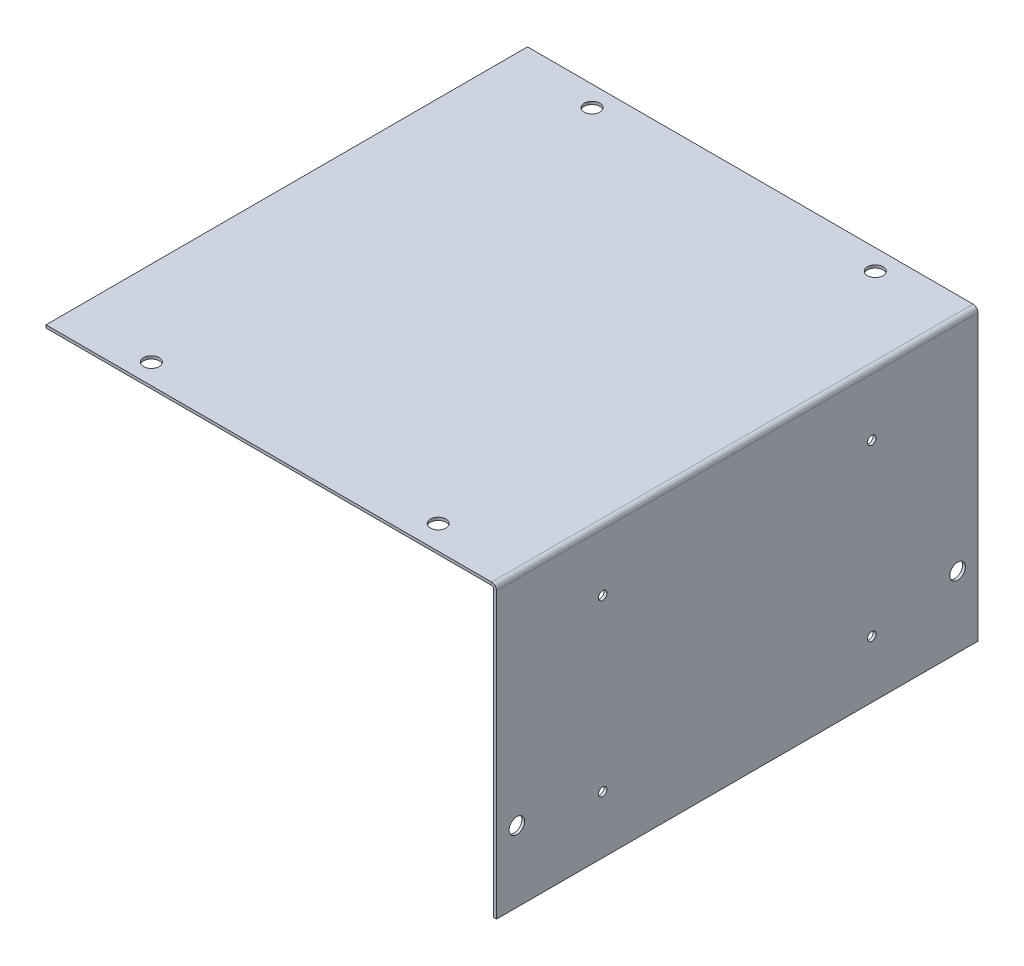
ISO-10303-21;
HEADER;
FILE_DESCRIPTION(('STEP AP214'),'2;1');
FILE_NAME('part.step','',(''),(''),'','','');
FILE_SCHEMA(('AUTOMOTIVE_DESIGN { 1 0 10303 214 1 1 1 1 }'));
ENDSEC;
DATA;
#1=APPLICATION_CONTEXT('core data for automotive mechanical design processes');
#2=APPLICATION_PROTOCOL_DEFINITION('international standard','automotive_design',2000,#1);
#3=PRODUCT_CONTEXT('',#1,'mechanical');
#4=PRODUCT('Part','Part','',(#3));
#5=PRODUCT_RELATED_PRODUCT_CATEGORY('part','',(#4));
#6=PRODUCT_DEFINITION_FORMATION('','',#4);
#7=PRODUCT_DEFINITION_CONTEXT('part definition',#1,'design');
#8=PRODUCT_DEFINITION('design','',#6,#7);
#9=PRODUCT_DEFINITION_SHAPE('','',#8);
#10=(LENGTH_UNIT() NAMED_UNIT(*) SI_UNIT(.MILLI.,.METRE.));
#11=(NAMED_UNIT(*) PLANE_ANGLE_UNIT() SI_UNIT($,.RADIAN.));
#12=(NAMED_UNIT(*) SI_UNIT($,.STERADIAN.) SOLID_ANGLE_UNIT());
#13=UNCERTAINTY_MEASURE_WITH_UNIT(LENGTH_MEASURE(1.E-05),#10,'distance_accuracy_value','');
#14=(GEOMETRIC_REPRESENTATION_CONTEXT(3) GLOBAL_UNCERTAINTY_ASSIGNED_CONTEXT((#13)) GLOBAL_UNIT_ASSIGNED_CONTEXT((#10,
#11,#12)) REPRESENTATION_CONTEXT('',''));
#15=CARTESIAN_POINT('',(0.,0.,0.));
#16=DIRECTION('',(0.,0.,1.));
#17=DIRECTION('',(1.,0.,0.));
#18=AXIS2_PLACEMENT_3D('',#15,#16,#17);
#19=CARTESIAN_POINT('',(1.71582040533197,26.7435444579773,170.));
#20=DIRECTION('',(0.,0.,1.));
#21=DIRECTION('',(1.,0.,0.));
#22=AXIS2_PLACEMENT_3D('',#19,#20,#21);
#23=PLANE('',#22);
#24=DIRECTION('',(0.,1.,0.));
#25=VECTOR('',#24,1.);
#26=CARTESIAN_POINT('',(1.71582040533197,26.7435444579773,170.));
#27=LINE('',#26,#25);
#28=CARTESIAN_POINT('',(1.71582040533197,26.7435444579773,170.));
#29=VERTEX_POINT('',#28);
#30=CARTESIAN_POINT('',(1.71582040533198,27.7435444579773,170.));
#31=VERTEX_POINT('',#30);
#32=EDGE_CURVE('E11',#29,#31,#27,.T.);
#33=ORIENTED_EDGE('',*,*,#32,.F.);
#34=CARTESIAN_POINT('',(1.71582040533196,26.0069444579773,170.));
#35=DIRECTION('',(0.,0.,1.));
#36=DIRECTION('',(1.,0.,0.));
#37=AXIS2_PLACEMENT_3D('',#34,#35,#36);
#38=CIRCLE('',#37,0.7366);
#39=CARTESIAN_POINT('',(2.45242040533196,26.0069444579773,170.));
#40=VERTEX_POINT('',#39);
#41=EDGE_CURVE('E126',#29,#40,#38,.F.);
#42=ORIENTED_EDGE('',*,*,#41,.T.);
#43=DIRECTION('',(-1.,0.,0.));
#44=VECTOR('',#43,1.);
#45=CARTESIAN_POINT('',(3.45242040533196,26.0069444579773,170.));
#46=LINE('',#45,#44);
#47=CARTESIAN_POINT('',(3.45242040533196,26.0069444579773,170.));
#48=VERTEX_POINT('',#47);
#49=EDGE_CURVE('E43',#48,#40,#46,.T.);
#50=ORIENTED_EDGE('',*,*,#49,.F.);
#51=CARTESIAN_POINT('',(1.71582040533196,26.0069444579773,170.));
#52=DIRECTION('',(0.,0.,1.));
#53=DIRECTION('',(1.,0.,0.));
#54=AXIS2_PLACEMENT_3D('',#51,#52,#53);
#55=CIRCLE('',#54,1.7366);
#56=EDGE_CURVE('E133',#31,#48,#55,.F.);
#57=ORIENTED_EDGE('',*,*,#56,.F.);
#58=EDGE_LOOP('',(#33,#42,#50,#57));
#59=FACE_BOUND('',#58,.T.);
#60=ADVANCED_FACE('F34',(#59),#23,.T.);
#61=CARTESIAN_POINT('',(3.45242040533196,26.0069444579773,170.));
#62=DIRECTION('',(0.,0.,1.));
#63=DIRECTION('',(1.,0.,0.));
#64=AXIS2_PLACEMENT_3D('',#61,#62,#63);
#65=PLANE('',#64);
#66=DIRECTION('',(1.,0.,0.));
#67=VECTOR('',#66,1.);
#68=CARTESIAN_POINT('',(-155.610979594668,26.7435444579772,170.));
#69=LINE('',#68,#67);
#70=CARTESIAN_POINT('',(-155.610979594668,26.7435444579772,170.));
#71=VERTEX_POINT('',#70);
#72=EDGE_CURVE('E121',#71,#29,#69,.T.);
#73=ORIENTED_EDGE('',*,*,#72,.T.);
#74=ORIENTED_EDGE('',*,*,#32,.T.);
#75=DIRECTION('',(1.,0.,0.));
#76=VECTOR('',#75,1.);
#77=CARTESIAN_POINT('',(-155.610979594668,27.7435444579772,170.));
#78=LINE('',#77,#76);
#79=CARTESIAN_POINT('',(-155.610979594668,27.7435444579772,170.));
#80=VERTEX_POINT('',#79);
#81=EDGE_CURVE('E131',#80,#31,#78,.T.);
#82=ORIENTED_EDGE('',*,*,#81,.F.);
#83=DIRECTION('',(0.,1.,0.));
#84=VECTOR('',#83,1.);
#85=CARTESIAN_POINT('',(-155.610979594668,26.7435444579772,170.));
#86=LINE('',#85,#84);
#87=EDGE_CURVE('E112',#71,#80,#86,.T.);
#88=ORIENTED_EDGE('',*,*,#87,.F.);
#89=EDGE_LOOP('',(#73,#74,#82,#88));
#90=FACE_BOUND('',#89,.T.);
#91=ADVANCED_FACE('F129',(#90),#65,.T.);
#92=CARTESIAN_POINT('',(2.45242040533196,26.0069444579773,0.));
#93=DIRECTION('',(0.,0.,-1.));
#94=DIRECTION('',(-1.,0.,0.));
#95=AXIS2_PLACEMENT_3D('',#92,#93,#94);
#96=PLANE('',#95);
#97=DIRECTION('',(1.,0.,0.));
#98=VECTOR('',#97,1.);
#99=CARTESIAN_POINT('',(2.45242040533196,26.0069444579773,0.));
#100=LINE('',#99,#98);
#101=CARTESIAN_POINT('',(2.45242040533196,26.0069444579773,0.));
#102=VERTEX_POINT('',#101);
#103=CARTESIAN_POINT('',(3.45242040533196,26.0069444579773,0.));
#104=VERTEX_POINT('',#103);
#105=EDGE_CURVE('E87',#102,#104,#100,.T.);
#106=ORIENTED_EDGE('',*,*,#105,.F.);
#107=CARTESIAN_POINT('',(1.71582040533196,26.0069444579773,0.));
#108=DIRECTION('',(0.,0.,1.));
#109=DIRECTION('',(1.,0.,0.));
#110=AXIS2_PLACEMENT_3D('',#107,#108,#109);
#111=CIRCLE('',#110,0.7366);
#112=CARTESIAN_POINT('',(1.71582040533197,26.7435444579773,0.));
#113=VERTEX_POINT('',#112);
#114=EDGE_CURVE('E156',#113,#102,#111,.F.);
#115=ORIENTED_EDGE('',*,*,#114,.F.);
#116=DIRECTION('',(0.,-1.,0.));
#117=VECTOR('',#116,1.);
#118=CARTESIAN_POINT('',(1.71582040533198,27.7435444579773,0.));
#119=LINE('',#118,#117);
#120=CARTESIAN_POINT('',(1.71582040533198,27.7435444579773,0.));
#121=VERTEX_POINT('',#120);
#122=EDGE_CURVE('E80',#121,#113,#119,.T.);
#123=ORIENTED_EDGE('',*,*,#122,.F.);
#124=CARTESIAN_POINT('',(1.71582040533196,26.0069444579773,0.));
#125=DIRECTION('',(0.,0.,1.));
#126=DIRECTION('',(1.,0.,0.));
#127=AXIS2_PLACEMENT_3D('',#124,#125,#126);
#128=CIRCLE('',#127,1.7366);
#129=EDGE_CURVE('E149',#121,#104,#128,.F.);
#130=ORIENTED_EDGE('',*,*,#129,.T.);
#131=EDGE_LOOP('',(#106,#115,#123,#130));
#132=FACE_BOUND('',#131,.T.);
#133=ADVANCED_FACE('F221',(#132),#96,.T.);
#134=CARTESIAN_POINT('',(1.71582040533198,27.7435444579773,0.));
#135=DIRECTION('',(0.,0.,-1.));
#136=DIRECTION('',(-1.,0.,0.));
#137=AXIS2_PLACEMENT_3D('',#134,#135,#136);
#138=PLANE('',#137);
#139=DIRECTION('',(0.,-1.,0.));
#140=VECTOR('',#139,1.);
#141=CARTESIAN_POINT('',(2.45242040533196,26.7435444579773,0.));
#142=LINE('',#141,#140);
#143=CARTESIAN_POINT('',(2.45242040533195,-74.4564555420229,0.));
#144=VERTEX_POINT('',#143);
#145=EDGE_CURVE('E139',#102,#144,#142,.T.);
#146=ORIENTED_EDGE('',*,*,#145,.F.);
#147=ORIENTED_EDGE('',*,*,#105,.T.);
#148=DIRECTION('',(0.,-1.,0.));
#149=VECTOR('',#148,1.);
#150=CARTESIAN_POINT('',(3.45242040533196,26.7435444579773,0.));
#151=LINE('',#150,#149);
#152=CARTESIAN_POINT('',(3.45242040533195,-74.4564555420229,0.));
#153=VERTEX_POINT('',#152);
#154=EDGE_CURVE('E146',#104,#153,#151,.T.);
#155=ORIENTED_EDGE('',*,*,#154,.T.);
#156=DIRECTION('',(-1.,0.,0.));
#157=VECTOR('',#156,1.);
#158=CARTESIAN_POINT('',(3.45242040533195,-74.4564555420229,0.));
#159=LINE('',#158,#157);
#160=EDGE_CURVE('E142',#153,#144,#159,.T.);
#161=ORIENTED_EDGE('',*,*,#160,.T.);
#162=EDGE_LOOP('',(#146,#147,#155,#161));
#163=FACE_BOUND('',#162,.T.);
#164=ADVANCED_FACE('F223',(#163),#138,.T.);
#165=CARTESIAN_POINT('',(2.45242040533196,26.7435444579773,170.));
#166=DIRECTION('',(1.,0.,0.));
#167=DIRECTION('',(0.,1.,0.));
#168=AXIS2_PLACEMENT_3D('',#165,#166,#167);
#169=PLANE('',#168);
#170=CARTESIAN_POINT('',(2.45242040533196,5.7570444579771,132.5));
#171=DIRECTION('',(1.,0.,0.));
#172=DIRECTION('',(0.,1.,0.));
#173=AXIS2_PLACEMENT_3D('',#170,#171,#172);
#174=CIRCLE('',#173,1.49999999999997);
#175=CARTESIAN_POINT('',(2.45242040533196,7.25704445797707,132.5));
#176=VERTEX_POINT('',#175);
#177=EDGE_CURVE('E465',#176,#176,#174,.T.);
#178=ORIENTED_EDGE('',*,*,#177,.T.);
#179=EDGE_LOOP('',(#178));
#180=FACE_BOUND('',#179,.T.);
#181=CARTESIAN_POINT('',(2.45242040533196,5.7570444579771,37.5));
#182=DIRECTION('',(1.,0.,0.));
#183=DIRECTION('',(0.,1.,0.));
#184=AXIS2_PLACEMENT_3D('',#181,#182,#183);
#185=CIRCLE('',#184,1.49999999999997);
#186=CARTESIAN_POINT('',(2.45242040533196,7.25704445797707,37.5));
#187=VERTEX_POINT('',#186);
#188=EDGE_CURVE('E469',#187,#187,#185,.T.);
#189=ORIENTED_EDGE('',*,*,#188,.T.);
#190=EDGE_LOOP('',(#189));
#191=FACE_BOUND('',#190,.T.);
#192=CARTESIAN_POINT('',(2.45242040533195,-54.2429555420229,37.5));
#193=DIRECTION('',(1.,0.,0.));
#194=DIRECTION('',(0.,1.,0.));
#195=AXIS2_PLACEMENT_3D('',#192,#193,#194);
#196=CIRCLE('',#195,1.49999999999997);
#197=CARTESIAN_POINT('',(2.45242040533195,-52.7429555420229,37.5));
#198=VERTEX_POINT('',#197);
#199=EDGE_CURVE('E478',#198,#198,#196,.T.);
#200=ORIENTED_EDGE('',*,*,#199,.T.);
#201=EDGE_LOOP('',(#200));
#202=FACE_BOUND('',#201,.T.);
#203=CARTESIAN_POINT('',(2.45242040533195,-54.2429555420229,132.5));
#204=DIRECTION('',(1.,0.,0.));
#205=DIRECTION('',(0.,1.,0.));
#206=AXIS2_PLACEMENT_3D('',#203,#204,#205);
#207=CIRCLE('',#206,1.49999999999997);
#208=CARTESIAN_POINT('',(2.45242040533195,-52.7429555420229,132.5));
#209=VERTEX_POINT('',#208);
#210=EDGE_CURVE('E484',#209,#209,#207,.T.);
#211=ORIENTED_EDGE('',*,*,#210,.T.);
#212=EDGE_LOOP('',(#211));
#213=FACE_BOUND('',#212,.T.);
#214=CARTESIAN_POINT('',(2.45242040533195,-49.4564555419283,7.19999999999119));
#215=DIRECTION('',(1.,0.,0.));
#216=DIRECTION('',(0.,1.,0.));
#217=AXIS2_PLACEMENT_3D('',#214,#215,#216);
#218=CIRCLE('',#217,2.75);
#219=CARTESIAN_POINT('',(2.45242040533195,-46.7064555419283,7.19999999999119));
#220=VERTEX_POINT('',#219);
#221=EDGE_CURVE('E490',#220,#220,#218,.T.);
#222=ORIENTED_EDGE('',*,*,#221,.T.);
#223=EDGE_LOOP('',(#222));
#224=FACE_BOUND('',#223,.T.);
#225=CARTESIAN_POINT('',(2.45242040533195,-49.4564555419272,162.799999999992));
#226=DIRECTION('',(1.,0.,0.));
#227=DIRECTION('',(0.,1.,0.));
#228=AXIS2_PLACEMENT_3D('',#225,#226,#227);
#229=CIRCLE('',#228,2.75000000000001);
#230=CARTESIAN_POINT('',(2.45242040533195,-46.7064555419271,162.799999999992));
#231=VERTEX_POINT('',#230);
#232=EDGE_CURVE('E495',#231,#231,#229,.T.);
#233=ORIENTED_EDGE('',*,*,#232,.T.);
#234=EDGE_LOOP('',(#233));
#235=FACE_BOUND('',#234,.T.);
#236=ORIENTED_EDGE('',*,*,#145,.T.);
#237=DIRECTION('',(0.,0.,-1.));
#238=VECTOR('',#237,1.);
#239=CARTESIAN_POINT('',(2.45242040533195,-74.4564555420229,170.));
#240=LINE('',#239,#238);
#241=CARTESIAN_POINT('',(2.45242040533195,-74.4564555420229,170.));
#242=VERTEX_POINT('',#241);
#243=EDGE_CURVE('E170',#242,#144,#240,.T.);
#244=ORIENTED_EDGE('',*,*,#243,.F.);
#245=DIRECTION('',(0.,-1.,0.));
#246=VECTOR('',#245,1.);
#247=CARTESIAN_POINT('',(2.45242040533196,26.7435444579773,170.));
#248=LINE('',#247,#246);
#249=EDGE_CURVE('E93',#40,#242,#248,.T.);
#250=ORIENTED_EDGE('',*,*,#249,.F.);
#251=DIRECTION('',(0.,0.,-1.));
#252=VECTOR('',#251,1.);
#253=CARTESIAN_POINT('',(2.45242040533196,26.0069444579773,170.));
#254=LINE('',#253,#252);
#255=EDGE_CURVE('E138',#40,#102,#254,.T.);
#256=ORIENTED_EDGE('',*,*,#255,.T.);
#257=EDGE_LOOP('',(#236,#244,#250,#256));
#258=FACE_BOUND('',#257,.T.);
#259=ADVANCED_FACE('F229',(#180,#191,#202,#213,#224,#235,#258),#169,.F.);
#260=CARTESIAN_POINT('',(3.45242040533195,-74.4564555420229,170.));
#261=DIRECTION('',(0.,-1.,0.));
#262=DIRECTION('',(0.,0.,-1.));
#263=AXIS2_PLACEMENT_3D('',#260,#261,#262);
#264=PLANE('',#263);
#265=ORIENTED_EDGE('',*,*,#160,.F.);
#266=DIRECTION('',(0.,0.,-1.));
#267=VECTOR('',#266,1.);
#268=CARTESIAN_POINT('',(3.45242040533195,-74.4564555420229,170.));
#269=LINE('',#268,#267);
#270=CARTESIAN_POINT('',(3.45242040533195,-74.4564555420229,170.));
#271=VERTEX_POINT('',#270);
#272=EDGE_CURVE('E168',#271,#153,#269,.T.);
#273=ORIENTED_EDGE('',*,*,#272,.F.);
#274=DIRECTION('',(-1.,0.,0.));
#275=VECTOR('',#274,1.);
#276=CARTESIAN_POINT('',(3.45242040533195,-74.4564555420229,170.));
#277=LINE('',#276,#275);
#278=EDGE_CURVE('E200',#271,#242,#277,.T.);
#279=ORIENTED_EDGE('',*,*,#278,.T.);
#280=ORIENTED_EDGE('',*,*,#243,.T.);
#281=EDGE_LOOP('',(#265,#273,#279,#280));
#282=FACE_BOUND('',#281,.T.);
#283=ADVANCED_FACE('F259',(#282),#264,.T.);
#284=CARTESIAN_POINT('',(3.45242040533196,26.7435444579773,170.));
#285=DIRECTION('',(1.,0.,0.));
#286=DIRECTION('',(0.,1.,0.));
#287=AXIS2_PLACEMENT_3D('',#284,#285,#286);
#288=PLANE('',#287);
#289=CARTESIAN_POINT('',(3.45242040533196,5.7570444579771,132.5));
#290=DIRECTION('',(1.,0.,0.));
#291=DIRECTION('',(0.,0.,-1.));
#292=AXIS2_PLACEMENT_3D('',#289,#290,#291);
#293=CIRCLE('',#292,1.49999999999998);
#294=CARTESIAN_POINT('',(3.45242040533196,5.7570444579771,131.));
#295=VERTEX_POINT('',#294);
#296=EDGE_CURVE('E462',#295,#295,#293,.T.);
#297=ORIENTED_EDGE('',*,*,#296,.F.);
#298=EDGE_LOOP('',(#297));
#299=FACE_BOUND('',#298,.T.);
#300=CARTESIAN_POINT('',(3.45242040533196,5.7570444579771,37.5));
#301=DIRECTION('',(1.,0.,0.));
#302=DIRECTION('',(0.,0.,-1.));
#303=AXIS2_PLACEMENT_3D('',#300,#301,#302);
#304=CIRCLE('',#303,1.49999999999998);
#305=CARTESIAN_POINT('',(3.45242040533196,5.7570444579771,36.));
#306=VERTEX_POINT('',#305);
#307=EDGE_CURVE('E466',#306,#306,#304,.T.);
#308=ORIENTED_EDGE('',*,*,#307,.F.);
#309=EDGE_LOOP('',(#308));
#310=FACE_BOUND('',#309,.T.);
#311=CARTESIAN_POINT('',(3.45242040533195,-54.2429555420229,37.5));
#312=DIRECTION('',(1.,0.,0.));
#313=DIRECTION('',(0.,0.,-1.));
#314=AXIS2_PLACEMENT_3D('',#311,#312,#313);
#315=CIRCLE('',#314,1.49999999999998);
#316=CARTESIAN_POINT('',(3.45242040533195,-54.2429555420229,36.));
#317=VERTEX_POINT('',#316);
#318=EDGE_CURVE('E475',#317,#317,#315,.T.);
#319=ORIENTED_EDGE('',*,*,#318,.F.);
#320=EDGE_LOOP('',(#319));
#321=FACE_BOUND('',#320,.T.);
#322=CARTESIAN_POINT('',(3.45242040533195,-54.2429555420229,132.5));
#323=DIRECTION('',(1.,0.,0.));
#324=DIRECTION('',(0.,0.,-1.));
#325=AXIS2_PLACEMENT_3D('',#322,#323,#324);
#326=CIRCLE('',#325,1.49999999999998);
#327=CARTESIAN_POINT('',(3.45242040533195,-54.2429555420229,131.));
#328=VERTEX_POINT('',#327);
#329=EDGE_CURVE('E481',#328,#328,#326,.T.);
#330=ORIENTED_EDGE('',*,*,#329,.F.);
#331=EDGE_LOOP('',(#330));
#332=FACE_BOUND('',#331,.T.);
#333=CARTESIAN_POINT('',(3.45242040533195,-49.4564555419283,7.19999999999119));
#334=DIRECTION('',(1.,0.,0.));
#335=DIRECTION('',(0.,1.,0.));
#336=AXIS2_PLACEMENT_3D('',#333,#334,#335);
#337=CIRCLE('',#336,2.75);
#338=CARTESIAN_POINT('',(3.45242040533195,-46.7064555419283,7.19999999999119));
#339=VERTEX_POINT('',#338);
#340=EDGE_CURVE('E487',#339,#339,#337,.T.);
#341=ORIENTED_EDGE('',*,*,#340,.F.);
#342=EDGE_LOOP('',(#341));
#343=FACE_BOUND('',#342,.T.);
#344=CARTESIAN_POINT('',(3.45242040533195,-49.4564555419272,162.799999999992));
#345=DIRECTION('',(1.,0.,0.));
#346=DIRECTION('',(0.,1.,0.));
#347=AXIS2_PLACEMENT_3D('',#344,#345,#346);
#348=CIRCLE('',#347,2.75000000000001);
#349=CARTESIAN_POINT('',(3.45242040533195,-46.7064555419271,162.799999999992));
#350=VERTEX_POINT('',#349);
#351=EDGE_CURVE('E493',#350,#350,#348,.T.);
#352=ORIENTED_EDGE('',*,*,#351,.F.);
#353=EDGE_LOOP('',(#352));
#354=FACE_BOUND('',#353,.T.);
#355=ORIENTED_EDGE('',*,*,#154,.F.);
#356=DIRECTION('',(0.,0.,-1.));
#357=VECTOR('',#356,1.);
#358=CARTESIAN_POINT('',(3.45242040533196,26.0069444579773,170.));
#359=LINE('',#358,#357);
#360=EDGE_CURVE('E165',#48,#104,#359,.T.);
#361=ORIENTED_EDGE('',*,*,#360,.F.);
#362=DIRECTION('',(0.,-1.,0.));
#363=VECTOR('',#362,1.);
#364=CARTESIAN_POINT('',(3.45242040533196,26.7435444579773,170.));
#365=LINE('',#364,#363);
#366=EDGE_CURVE('E203',#48,#271,#365,.T.);
#367=ORIENTED_EDGE('',*,*,#366,.T.);
#368=ORIENTED_EDGE('',*,*,#272,.T.);
#369=EDGE_LOOP('',(#355,#361,#367,#368));
#370=FACE_BOUND('',#369,.T.);
#371=ADVANCED_FACE('F264',(#299,#310,#321,#332,#343,#354,#370),#288,.T.);
#372=CARTESIAN_POINT('',(1.71582040533196,26.0069444579773,170.));
#373=DIRECTION('',(0.,0.,-1.));
#374=DIRECTION('',(-1.,0.,0.));
#375=AXIS2_PLACEMENT_3D('',#372,#373,#374);
#376=CYLINDRICAL_SURFACE('',#375,1.7366);
#377=ORIENTED_EDGE('',*,*,#129,.F.);
#378=DIRECTION('',(0.,0.,-1.));
#379=VECTOR('',#378,1.);
#380=CARTESIAN_POINT('',(1.71582040533198,27.7435444579773,170.));
#381=LINE('',#380,#379);
#382=EDGE_CURVE('E162',#31,#121,#381,.T.);
#383=ORIENTED_EDGE('',*,*,#382,.F.);
#384=ORIENTED_EDGE('',*,*,#56,.T.);
#385=ORIENTED_EDGE('',*,*,#360,.T.);
#386=EDGE_LOOP('',(#377,#383,#384,#385));
#387=FACE_BOUND('',#386,.T.);
#388=ADVANCED_FACE('F210',(#387),#376,.T.);
#389=CARTESIAN_POINT('',(-155.610979594668,27.7435444579772,170.));
#390=DIRECTION('',(0.,1.,0.));
#391=DIRECTION('',(-1.,0.,0.));
#392=AXIS2_PLACEMENT_3D('',#389,#390,#391);
#393=PLANE('',#392);
#394=CARTESIAN_POINT('',(-125.610979594656,27.7435444579773,7.19999999999113));
#395=DIRECTION('',(0.,1.,0.));
#396=DIRECTION('',(-1.,0.,0.));
#397=AXIS2_PLACEMENT_3D('',#394,#395,#396);
#398=CIRCLE('',#397,2.75000000000001);
#399=CARTESIAN_POINT('',(-128.360979594656,27.7435444579773,7.19999999999113));
#400=VERTEX_POINT('',#399);
#401=EDGE_CURVE('E193',#400,#400,#398,.T.);
#402=ORIENTED_EDGE('',*,*,#401,.F.);
#403=EDGE_LOOP('',(#402));
#404=FACE_BOUND('',#403,.T.);
#405=CARTESIAN_POINT('',(-25.6109795946561,27.7435444579773,7.19999999999076));
#406=DIRECTION('',(0.,1.,0.));
#407=DIRECTION('',(-1.,0.,0.));
#408=AXIS2_PLACEMENT_3D('',#405,#406,#407);
#409=CIRCLE('',#408,2.75);
#410=CARTESIAN_POINT('',(-28.3609795946561,27.7435444579773,7.19999999999076));
#411=VERTEX_POINT('',#410);
#412=EDGE_CURVE('E183',#411,#411,#409,.T.);
#413=ORIENTED_EDGE('',*,*,#412,.F.);
#414=EDGE_LOOP('',(#413));
#415=FACE_BOUND('',#414,.T.);
#416=CARTESIAN_POINT('',(-25.6109795946555,27.7435444579773,161.523456843835));
#417=DIRECTION('',(0.,1.,0.));
#418=DIRECTION('',(-1.,0.,0.));
#419=AXIS2_PLACEMENT_3D('',#416,#417,#418);
#420=CIRCLE('',#419,2.75);
#421=CARTESIAN_POINT('',(-28.3609795946555,27.7435444579773,161.523456843835));
#422=VERTEX_POINT('',#421);
#423=EDGE_CURVE('E180',#422,#422,#420,.T.);
#424=ORIENTED_EDGE('',*,*,#423,.F.);
#425=EDGE_LOOP('',(#424));
#426=FACE_BOUND('',#425,.T.);
#427=CARTESIAN_POINT('',(-125.610979594655,27.7435444579773,162.799999999992));
#428=DIRECTION('',(0.,1.,0.));
#429=DIRECTION('',(-1.,0.,0.));
#430=AXIS2_PLACEMENT_3D('',#427,#428,#429);
#431=CIRCLE('',#430,2.75000000000001);
#432=CARTESIAN_POINT('',(-128.360979594655,27.7435444579773,162.799999999992));
#433=VERTEX_POINT('',#432);
#434=EDGE_CURVE('E177',#433,#433,#431,.T.);
#435=ORIENTED_EDGE('',*,*,#434,.F.);
#436=EDGE_LOOP('',(#435));
#437=FACE_BOUND('',#436,.T.);
#438=DIRECTION('',(1.,0.,0.));
#439=VECTOR('',#438,1.);
#440=CARTESIAN_POINT('',(-155.610979594668,27.7435444579772,0.));
#441=LINE('',#440,#439);
#442=CARTESIAN_POINT('',(-155.610979594668,27.7435444579772,0.));
#443=VERTEX_POINT('',#442);
#444=EDGE_CURVE('E151',#443,#121,#441,.T.);
#445=ORIENTED_EDGE('',*,*,#444,.F.);
#446=DIRECTION('',(0.,0.,-1.));
#447=VECTOR('',#446,1.);
#448=CARTESIAN_POINT('',(-155.610979594668,27.7435444579772,170.));
#449=LINE('',#448,#447);
#450=EDGE_CURVE('E116',#80,#443,#449,.T.);
#451=ORIENTED_EDGE('',*,*,#450,.F.);
#452=ORIENTED_EDGE('',*,*,#81,.T.);
#453=ORIENTED_EDGE('',*,*,#382,.T.);
#454=EDGE_LOOP('',(#445,#451,#452,#453));
#455=FACE_BOUND('',#454,.T.);
#456=ADVANCED_FACE('F216',(#404,#415,#426,#437,#455),#393,.T.);
#457=CARTESIAN_POINT('',(-155.610979594668,26.7435444579772,170.));
#458=DIRECTION('',(-1.,0.,0.));
#459=DIRECTION('',(0.,0.,1.));
#460=AXIS2_PLACEMENT_3D('',#457,#458,#459);
#461=PLANE('',#460);
#462=DIRECTION('',(0.,1.,0.));
#463=VECTOR('',#462,1.);
#464=CARTESIAN_POINT('',(-155.610979594668,26.7435444579772,0.));
#465=LINE('',#464,#463);
#466=CARTESIAN_POINT('',(-155.610979594668,26.7435444579772,0.));
#467=VERTEX_POINT('',#466);
#468=EDGE_CURVE('E114',#467,#443,#465,.T.);
#469=ORIENTED_EDGE('',*,*,#468,.F.);
#470=DIRECTION('',(0.,0.,-1.));
#471=VECTOR('',#470,1.);
#472=CARTESIAN_POINT('',(-155.610979594668,26.7435444579772,170.));
#473=LINE('',#472,#471);
#474=EDGE_CURVE('E108',#71,#467,#473,.T.);
#475=ORIENTED_EDGE('',*,*,#474,.F.);
#476=ORIENTED_EDGE('',*,*,#87,.T.);
#477=ORIENTED_EDGE('',*,*,#450,.T.);
#478=EDGE_LOOP('',(#469,#475,#476,#477));
#479=FACE_BOUND('',#478,.T.);
#480=ADVANCED_FACE('F110',(#479),#461,.T.);
#481=CARTESIAN_POINT('',(-155.610979594668,26.7435444579772,170.));
#482=DIRECTION('',(0.,1.,0.));
#483=DIRECTION('',(-1.,0.,0.));
#484=AXIS2_PLACEMENT_3D('',#481,#482,#483);
#485=PLANE('',#484);
#486=CARTESIAN_POINT('',(-125.610979594656,26.7435444579773,7.19999999999113));
#487=DIRECTION('',(0.,1.,0.));
#488=DIRECTION('',(-1.,0.,0.));
#489=AXIS2_PLACEMENT_3D('',#486,#487,#488);
#490=CIRCLE('',#489,2.75000000000001);
#491=CARTESIAN_POINT('',(-128.360979594656,26.7435444579773,7.19999999999113));
#492=VERTEX_POINT('',#491);
#493=EDGE_CURVE('E37',#492,#492,#490,.T.);
#494=ORIENTED_EDGE('',*,*,#493,.T.);
#495=EDGE_LOOP('',(#494));
#496=FACE_BOUND('',#495,.T.);
#497=CARTESIAN_POINT('',(-25.6109795946561,26.7435444579773,7.19999999999076));
#498=DIRECTION('',(0.,1.,0.));
#499=DIRECTION('',(-1.,0.,0.));
#500=AXIS2_PLACEMENT_3D('',#497,#498,#499);
#501=CIRCLE('',#500,2.75);
#502=CARTESIAN_POINT('',(-28.3609795946561,26.7435444579773,7.19999999999076));
#503=VERTEX_POINT('',#502);
#504=EDGE_CURVE('E181',#503,#503,#501,.T.);
#505=ORIENTED_EDGE('',*,*,#504,.T.);
#506=EDGE_LOOP('',(#505));
#507=FACE_BOUND('',#506,.T.);
#508=CARTESIAN_POINT('',(-25.6109795946555,26.7435444579773,161.523456843835));
#509=DIRECTION('',(0.,1.,0.));
#510=DIRECTION('',(-1.,0.,0.));
#511=AXIS2_PLACEMENT_3D('',#508,#509,#510);
#512=CIRCLE('',#511,2.75);
#513=CARTESIAN_POINT('',(-28.3609795946555,26.7435444579773,161.523456843835));
#514=VERTEX_POINT('',#513);
#515=EDGE_CURVE('E178',#514,#514,#512,.T.);
#516=ORIENTED_EDGE('',*,*,#515,.T.);
#517=EDGE_LOOP('',(#516));
#518=FACE_BOUND('',#517,.T.);
#519=CARTESIAN_POINT('',(-125.610979594655,26.7435444579773,162.799999999992));
#520=DIRECTION('',(0.,1.,0.));
#521=DIRECTION('',(-1.,0.,0.));
#522=AXIS2_PLACEMENT_3D('',#519,#520,#521);
#523=CIRCLE('',#522,2.75000000000001);
#524=CARTESIAN_POINT('',(-128.360979594655,26.7435444579773,162.799999999992));
#525=VERTEX_POINT('',#524);
#526=EDGE_CURVE('E143',#525,#525,#523,.T.);
#527=ORIENTED_EDGE('',*,*,#526,.T.);
#528=EDGE_LOOP('',(#527));
#529=FACE_BOUND('',#528,.T.);
#530=DIRECTION('',(1.,0.,0.));
#531=VECTOR('',#530,1.);
#532=CARTESIAN_POINT('',(-155.610979594668,26.7435444579772,0.));
#533=LINE('',#532,#531);
#534=EDGE_CURVE('E154',#467,#113,#533,.T.);
#535=ORIENTED_EDGE('',*,*,#534,.T.);
#536=DIRECTION('',(0.,0.,-1.));
#537=VECTOR('',#536,1.);
#538=CARTESIAN_POINT('',(1.71582040533197,26.7435444579773,170.));
#539=LINE('',#538,#537);
#540=EDGE_CURVE('E117',#29,#113,#539,.T.);
#541=ORIENTED_EDGE('',*,*,#540,.F.);
#542=ORIENTED_EDGE('',*,*,#72,.F.);
#543=ORIENTED_EDGE('',*,*,#474,.T.);
#544=EDGE_LOOP('',(#535,#541,#542,#543));
#545=FACE_BOUND('',#544,.T.);
#546=ADVANCED_FACE('F122',(#496,#507,#518,#529,#545),#485,.F.);
#547=CARTESIAN_POINT('',(1.71582040533196,26.0069444579773,170.));
#548=DIRECTION('',(0.,0.,-1.));
#549=DIRECTION('',(-1.,0.,0.));
#550=AXIS2_PLACEMENT_3D('',#547,#548,#549);
#551=CYLINDRICAL_SURFACE('',#550,0.7366);
#552=ORIENTED_EDGE('',*,*,#114,.T.);
#553=ORIENTED_EDGE('',*,*,#255,.F.);
#554=ORIENTED_EDGE('',*,*,#41,.F.);
#555=ORIENTED_EDGE('',*,*,#540,.T.);
#556=EDGE_LOOP('',(#552,#553,#554,#555));
#557=FACE_BOUND('',#556,.T.);
#558=ADVANCED_FACE('F219',(#557),#551,.F.);
#559=CARTESIAN_POINT('',(1.71582040533196,26.0069444579773,170.));
#560=DIRECTION('',(0.,0.,1.));
#561=DIRECTION('',(1.,0.,0.));
#562=AXIS2_PLACEMENT_3D('',#559,#560,#561);
#563=PLANE('',#562);
#564=ORIENTED_EDGE('',*,*,#249,.T.);
#565=ORIENTED_EDGE('',*,*,#278,.F.);
#566=ORIENTED_EDGE('',*,*,#366,.F.);
#567=ORIENTED_EDGE('',*,*,#49,.T.);
#568=EDGE_LOOP('',(#564,#565,#566,#567));
#569=FACE_BOUND('',#568,.T.);
#570=ADVANCED_FACE('F299',(#569),#563,.T.);
#571=CARTESIAN_POINT('',(1.71582040533196,26.0069444579773,0.));
#572=DIRECTION('',(0.,0.,1.));
#573=DIRECTION('',(1.,0.,0.));
#574=AXIS2_PLACEMENT_3D('',#571,#572,#573);
#575=PLANE('',#574);
#576=ORIENTED_EDGE('',*,*,#444,.T.);
#577=ORIENTED_EDGE('',*,*,#122,.T.);
#578=ORIENTED_EDGE('',*,*,#534,.F.);
#579=ORIENTED_EDGE('',*,*,#468,.T.);
#580=EDGE_LOOP('',(#576,#577,#578,#579));
#581=FACE_BOUND('',#580,.T.);
#582=ADVANCED_FACE('F217',(#581),#575,.F.);
#583=CARTESIAN_POINT('',(-125.610979594655,17.7435444579773,162.799999999992));
#584=DIRECTION('',(0.,1.,0.));
#585=DIRECTION('',(-1.,0.,0.));
#586=AXIS2_PLACEMENT_3D('',#583,#584,#585);
#587=CYLINDRICAL_SURFACE('',#586,2.75000000000001);
#588=ORIENTED_EDGE('',*,*,#434,.T.);
#589=EDGE_LOOP('',(#588));
#590=FACE_BOUND('',#589,.T.);
#591=ORIENTED_EDGE('',*,*,#526,.F.);
#592=EDGE_LOOP('',(#591));
#593=FACE_BOUND('',#592,.T.);
#594=ADVANCED_FACE('F318',(#590,#593),#587,.F.);
#595=CARTESIAN_POINT('',(-25.6109795946555,17.7435444579773,161.523456843835));
#596=DIRECTION('',(0.,1.,0.));
#597=DIRECTION('',(-1.,0.,0.));
#598=AXIS2_PLACEMENT_3D('',#595,#596,#597);
#599=CYLINDRICAL_SURFACE('',#598,2.75);
#600=ORIENTED_EDGE('',*,*,#423,.T.);
#601=EDGE_LOOP('',(#600));
#602=FACE_BOUND('',#601,.T.);
#603=ORIENTED_EDGE('',*,*,#515,.F.);
#604=EDGE_LOOP('',(#603));
#605=FACE_BOUND('',#604,.T.);
#606=ADVANCED_FACE('F344',(#602,#605),#599,.F.);
#607=CARTESIAN_POINT('',(-25.6109795946561,17.7435444579773,7.19999999999076));
#608=DIRECTION('',(0.,1.,0.));
#609=DIRECTION('',(-1.,0.,0.));
#610=AXIS2_PLACEMENT_3D('',#607,#608,#609);
#611=CYLINDRICAL_SURFACE('',#610,2.75);
#612=ORIENTED_EDGE('',*,*,#412,.T.);
#613=EDGE_LOOP('',(#612));
#614=FACE_BOUND('',#613,.T.);
#615=ORIENTED_EDGE('',*,*,#504,.F.);
#616=EDGE_LOOP('',(#615));
#617=FACE_BOUND('',#616,.T.);
#618=ADVANCED_FACE('F355',(#614,#617),#611,.F.);
#619=CARTESIAN_POINT('',(-125.610979594656,17.7435444579773,7.19999999999113));
#620=DIRECTION('',(0.,1.,0.));
#621=DIRECTION('',(-1.,0.,0.));
#622=AXIS2_PLACEMENT_3D('',#619,#620,#621);
#623=CYLINDRICAL_SURFACE('',#622,2.75000000000001);
#624=ORIENTED_EDGE('',*,*,#401,.T.);
#625=EDGE_LOOP('',(#624));
#626=FACE_BOUND('',#625,.T.);
#627=ORIENTED_EDGE('',*,*,#493,.F.);
#628=EDGE_LOOP('',(#627));
#629=FACE_BOUND('',#628,.T.);
#630=ADVANCED_FACE('F366',(#626,#629),#623,.F.);
#631=CARTESIAN_POINT('',(-6.54757959466805,-49.4564555419272,162.799999999992));
#632=DIRECTION('',(1.,0.,0.));
#633=DIRECTION('',(0.,1.,0.));
#634=AXIS2_PLACEMENT_3D('',#631,#632,#633);
#635=CYLINDRICAL_SURFACE('',#634,2.75000000000001);
#636=ORIENTED_EDGE('',*,*,#351,.T.);
#637=EDGE_LOOP('',(#636));
#638=FACE_BOUND('',#637,.T.);
#639=ORIENTED_EDGE('',*,*,#232,.F.);
#640=EDGE_LOOP('',(#639));
#641=FACE_BOUND('',#640,.T.);
#642=ADVANCED_FACE('F376',(#638,#641),#635,.F.);
#643=CARTESIAN_POINT('',(-6.54757959466805,-49.4564555419283,7.19999999999119));
#644=DIRECTION('',(1.,0.,0.));
#645=DIRECTION('',(0.,1.,0.));
#646=AXIS2_PLACEMENT_3D('',#643,#644,#645);
#647=CYLINDRICAL_SURFACE('',#646,2.75);
#648=ORIENTED_EDGE('',*,*,#340,.T.);
#649=EDGE_LOOP('',(#648));
#650=FACE_BOUND('',#649,.T.);
#651=ORIENTED_EDGE('',*,*,#221,.F.);
#652=EDGE_LOOP('',(#651));
#653=FACE_BOUND('',#652,.T.);
#654=ADVANCED_FACE('F387',(#650,#653),#647,.F.);
#655=CARTESIAN_POINT('',(3.45242040533195,-54.2429555420229,132.5));
#656=DIRECTION('',(1.,0.,0.));
#657=DIRECTION('',(0.,0.,-1.));
#658=AXIS2_PLACEMENT_3D('',#655,#656,#657);
#659=CYLINDRICAL_SURFACE('',#658,1.49999999999997);
#660=ORIENTED_EDGE('',*,*,#329,.T.);
#661=EDGE_LOOP('',(#660));
#662=FACE_BOUND('',#661,.T.);
#663=ORIENTED_EDGE('',*,*,#210,.F.);
#664=EDGE_LOOP('',(#663));
#665=FACE_BOUND('',#664,.T.);
#666=ADVANCED_FACE('F398',(#662,#665),#659,.F.);
#667=CARTESIAN_POINT('',(3.45242040533195,-54.2429555420229,37.5));
#668=DIRECTION('',(1.,0.,0.));
#669=DIRECTION('',(0.,0.,-1.));
#670=AXIS2_PLACEMENT_3D('',#667,#668,#669);
#671=CYLINDRICAL_SURFACE('',#670,1.49999999999997);
#672=ORIENTED_EDGE('',*,*,#318,.T.);
#673=EDGE_LOOP('',(#672));
#674=FACE_BOUND('',#673,.T.);
#675=ORIENTED_EDGE('',*,*,#199,.F.);
#676=EDGE_LOOP('',(#675));
#677=FACE_BOUND('',#676,.T.);
#678=ADVANCED_FACE('F425',(#674,#677),#671,.F.);
#679=CARTESIAN_POINT('',(3.45242040533196,5.7570444579771,37.5));
#680=DIRECTION('',(1.,0.,0.));
#681=DIRECTION('',(0.,0.,-1.));
#682=AXIS2_PLACEMENT_3D('',#679,#680,#681);
#683=CYLINDRICAL_SURFACE('',#682,1.49999999999997);
#684=ORIENTED_EDGE('',*,*,#307,.T.);
#685=EDGE_LOOP('',(#684));
#686=FACE_BOUND('',#685,.T.);
#687=ORIENTED_EDGE('',*,*,#188,.F.);
#688=EDGE_LOOP('',(#687));
#689=FACE_BOUND('',#688,.T.);
#690=ADVANCED_FACE('F435',(#686,#689),#683,.F.);
#691=CARTESIAN_POINT('',(3.45242040533196,5.7570444579771,132.5));
#692=DIRECTION('',(1.,0.,0.));
#693=DIRECTION('',(0.,0.,-1.));
#694=AXIS2_PLACEMENT_3D('',#691,#692,#693);
#695=CYLINDRICAL_SURFACE('',#694,1.49999999999997);
#696=ORIENTED_EDGE('',*,*,#296,.T.);
#697=EDGE_LOOP('',(#696));
#698=FACE_BOUND('',#697,.T.);
#699=ORIENTED_EDGE('',*,*,#177,.F.);
#700=EDGE_LOOP('',(#699));
#701=FACE_BOUND('',#700,.T.);
#702=ADVANCED_FACE('F445',(#698,#701),#695,.F.);
#703=CLOSED_SHELL('',(#60,#91,#133,#164,#259,#283,#371,#388,#456,#480,#546,#558,#570,#582,#594,
#606,#618,#630,#642,#654,#666,#678,#690,#702));
#704=MANIFOLD_SOLID_BREP('B2',#703);
#705=ADVANCED_BREP_SHAPE_REPRESENTATION('',(#18,#704),#14);
#706=SHAPE_DEFINITION_REPRESENTATION(#9,#705);
ENDSEC;
END-ISO-10303-21;
